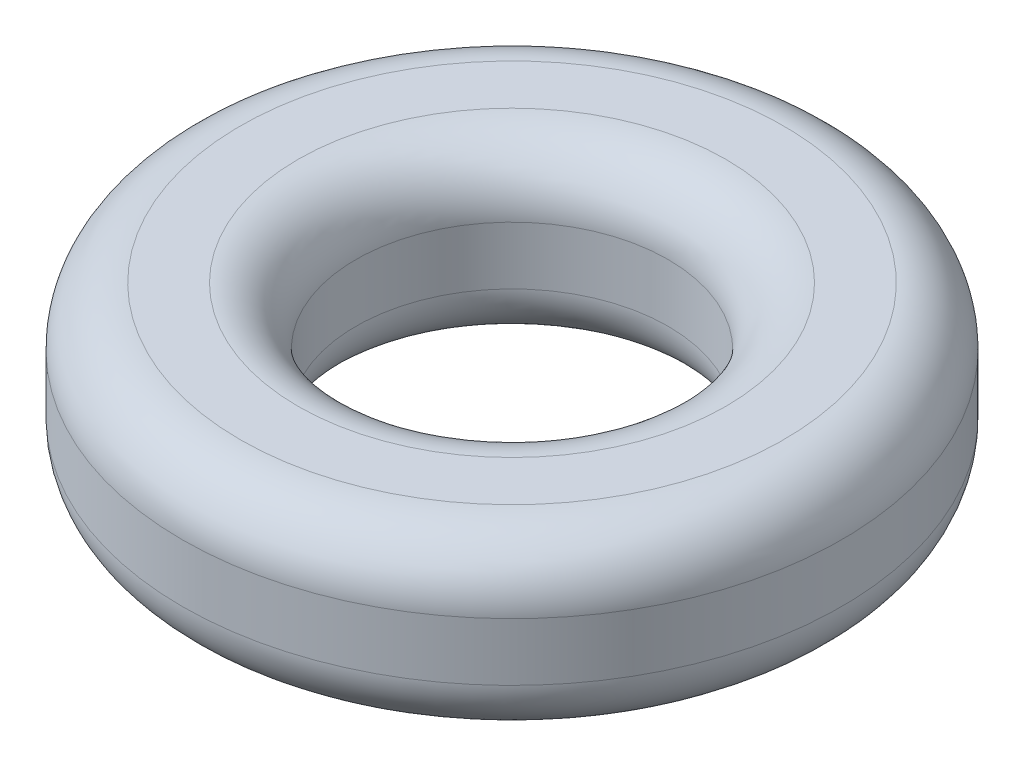
ISO-10303-21;
HEADER;
FILE_DESCRIPTION(('STEP AP214'),'2;1');
FILE_NAME('part.step','',(''),(''),'','','');
FILE_SCHEMA(('AUTOMOTIVE_DESIGN { 1 0 10303 214 1 1 1 1 }'));
ENDSEC;
DATA;
#1=APPLICATION_CONTEXT('core data for automotive mechanical design processes');
#2=APPLICATION_PROTOCOL_DEFINITION('international standard','automotive_design',2000,#1);
#3=PRODUCT_CONTEXT('',#1,'mechanical');
#4=PRODUCT('Part','Part','',(#3));
#5=PRODUCT_RELATED_PRODUCT_CATEGORY('part','',(#4));
#6=PRODUCT_DEFINITION_FORMATION('','',#4);
#7=PRODUCT_DEFINITION_CONTEXT('part definition',#1,'design');
#8=PRODUCT_DEFINITION('design','',#6,#7);
#9=PRODUCT_DEFINITION_SHAPE('','',#8);
#10=(LENGTH_UNIT() NAMED_UNIT(*) SI_UNIT(.MILLI.,.METRE.));
#11=(NAMED_UNIT(*) PLANE_ANGLE_UNIT() SI_UNIT($,.RADIAN.));
#12=(NAMED_UNIT(*) SI_UNIT($,.STERADIAN.) SOLID_ANGLE_UNIT());
#13=UNCERTAINTY_MEASURE_WITH_UNIT(LENGTH_MEASURE(1.E-05),#10,'distance_accuracy_value','');
#14=(GEOMETRIC_REPRESENTATION_CONTEXT(3) GLOBAL_UNCERTAINTY_ASSIGNED_CONTEXT((#13)) GLOBAL_UNIT_ASSIGNED_CONTEXT((#10,
#11,#12)) REPRESENTATION_CONTEXT('',''));
#15=CARTESIAN_POINT('',(0.,0.,0.));
#16=DIRECTION('',(0.,0.,1.));
#17=DIRECTION('',(1.,0.,0.));
#18=AXIS2_PLACEMENT_3D('',#15,#16,#17);
#19=CARTESIAN_POINT('',(0.,1.5,0.));
#20=DIRECTION('',(0.,1.,0.));
#21=DIRECTION('',(0.,0.,1.));
#22=AXIS2_PLACEMENT_3D('',#19,#20,#21);
#23=PLANE('',#22);
#24=CARTESIAN_POINT('',(0.,1.5,0.));
#25=DIRECTION('',(0.,1.,0.));
#26=DIRECTION('',(0.,0.,1.));
#27=AXIS2_PLACEMENT_3D('',#24,#25,#26);
#28=CIRCLE('',#27,2.35);
#29=CARTESIAN_POINT('',(0.,1.5,2.35));
#30=VERTEX_POINT('',#29);
#31=EDGE_CURVE('E56',#30,#30,#28,.T.);
#32=ORIENTED_EDGE('',*,*,#31,.T.);
#33=EDGE_LOOP('',(#32));
#34=FACE_BOUND('',#33,.T.);
#35=CARTESIAN_POINT('',(0.,1.5,0.));
#36=DIRECTION('',(0.,1.,0.));
#37=DIRECTION('',(0.,0.,1.));
#38=AXIS2_PLACEMENT_3D('',#35,#36,#37);
#39=CIRCLE('',#38,1.85);
#40=CARTESIAN_POINT('',(0.,1.5,1.85));
#41=VERTEX_POINT('',#40);
#42=EDGE_CURVE('E61',#41,#41,#39,.F.);
#43=ORIENTED_EDGE('',*,*,#42,.T.);
#44=EDGE_LOOP('',(#43));
#45=FACE_BOUND('',#44,.T.);
#46=ADVANCED_FACE('F43',(#34,#45),#23,.T.);
#47=CARTESIAN_POINT('',(0.,0.,0.));
#48=DIRECTION('',(0.,1.,0.));
#49=DIRECTION('',(0.,0.,1.));
#50=AXIS2_PLACEMENT_3D('',#47,#48,#49);
#51=PLANE('',#50);
#52=CARTESIAN_POINT('',(0.,0.,0.));
#53=DIRECTION('',(0.,1.,0.));
#54=DIRECTION('',(0.,0.,1.));
#55=AXIS2_PLACEMENT_3D('',#52,#53,#54);
#56=CIRCLE('',#55,2.35);
#57=CARTESIAN_POINT('',(0.,0.,2.35));
#58=VERTEX_POINT('',#57);
#59=EDGE_CURVE('E67',#58,#58,#56,.F.);
#60=ORIENTED_EDGE('',*,*,#59,.T.);
#61=EDGE_LOOP('',(#60));
#62=FACE_BOUND('',#61,.T.);
#63=CARTESIAN_POINT('',(0.,0.,0.));
#64=DIRECTION('',(0.,1.,0.));
#65=DIRECTION('',(0.,0.,1.));
#66=AXIS2_PLACEMENT_3D('',#63,#64,#65);
#67=CIRCLE('',#66,1.85);
#68=CARTESIAN_POINT('',(0.,0.,1.85));
#69=VERTEX_POINT('',#68);
#70=EDGE_CURVE('E71',#69,#69,#67,.T.);
#71=ORIENTED_EDGE('',*,*,#70,.T.);
#72=EDGE_LOOP('',(#71));
#73=FACE_BOUND('',#72,.T.);
#74=ADVANCED_FACE('F96',(#62,#73),#51,.F.);
#75=CARTESIAN_POINT('',(0.,1.5,0.));
#76=DIRECTION('',(0.,-1.,0.));
#77=DIRECTION('',(0.,0.,-1.));
#78=AXIS2_PLACEMENT_3D('',#75,#76,#77);
#79=CYLINDRICAL_SURFACE('',#78,2.85);
#80=CARTESIAN_POINT('',(0.,0.5,0.));
#81=DIRECTION('',(0.,1.,0.));
#82=DIRECTION('',(0.,0.,1.));
#83=AXIS2_PLACEMENT_3D('',#80,#81,#82);
#84=CIRCLE('',#83,2.85);
#85=CARTESIAN_POINT('',(0.,0.5,2.85));
#86=VERTEX_POINT('',#85);
#87=EDGE_CURVE('E75',#86,#86,#84,.T.);
#88=ORIENTED_EDGE('',*,*,#87,.T.);
#89=EDGE_LOOP('',(#88));
#90=FACE_BOUND('',#89,.T.);
#91=CARTESIAN_POINT('',(0.,1.,0.));
#92=DIRECTION('',(0.,1.,0.));
#93=DIRECTION('',(0.,0.,1.));
#94=AXIS2_PLACEMENT_3D('',#91,#92,#93);
#95=CIRCLE('',#94,2.85);
#96=CARTESIAN_POINT('',(0.,1.,2.85));
#97=VERTEX_POINT('',#96);
#98=EDGE_CURVE('E79',#97,#97,#95,.F.);
#99=ORIENTED_EDGE('',*,*,#98,.T.);
#100=EDGE_LOOP('',(#99));
#101=FACE_BOUND('',#100,.T.);
#102=ADVANCED_FACE('F84',(#90,#101),#79,.T.);
#103=CARTESIAN_POINT('',(0.,1.5,0.));
#104=DIRECTION('',(0.,-1.,0.));
#105=DIRECTION('',(0.,0.,-1.));
#106=AXIS2_PLACEMENT_3D('',#103,#104,#105);
#107=CYLINDRICAL_SURFACE('',#106,1.35);
#108=CARTESIAN_POINT('',(0.,0.5,0.));
#109=DIRECTION('',(0.,1.,0.));
#110=DIRECTION('',(0.,0.,1.));
#111=AXIS2_PLACEMENT_3D('',#108,#109,#110);
#112=CIRCLE('',#111,1.35);
#113=CARTESIAN_POINT('',(0.,0.5,1.35));
#114=VERTEX_POINT('',#113);
#115=EDGE_CURVE('E10',#114,#114,#112,.F.);
#116=ORIENTED_EDGE('',*,*,#115,.T.);
#117=EDGE_LOOP('',(#116));
#118=FACE_BOUND('',#117,.T.);
#119=CARTESIAN_POINT('',(0.,1.,0.));
#120=DIRECTION('',(0.,1.,0.));
#121=DIRECTION('',(0.,0.,1.));
#122=AXIS2_PLACEMENT_3D('',#119,#120,#121);
#123=CIRCLE('',#122,1.35);
#124=CARTESIAN_POINT('',(0.,1.,1.35));
#125=VERTEX_POINT('',#124);
#126=EDGE_CURVE('E51',#125,#125,#123,.T.);
#127=ORIENTED_EDGE('',*,*,#126,.T.);
#128=EDGE_LOOP('',(#127));
#129=FACE_BOUND('',#128,.T.);
#130=ADVANCED_FACE('F112',(#118,#129),#107,.F.);
#131=CARTESIAN_POINT('',(0.,0.5,0.));
#132=DIRECTION('',(0.,1.,0.));
#133=DIRECTION('',(0.,0.,1.));
#134=AXIS2_PLACEMENT_3D('',#131,#132,#133);
#135=TOROIDAL_SURFACE('',#134,2.35,0.5);
#136=ORIENTED_EDGE('',*,*,#59,.F.);
#137=EDGE_LOOP('',(#136));
#138=FACE_BOUND('',#137,.T.);
#139=ORIENTED_EDGE('',*,*,#87,.F.);
#140=EDGE_LOOP('',(#139));
#141=FACE_BOUND('',#140,.T.);
#142=ADVANCED_FACE('F90',(#138,#141),#135,.T.);
#143=CARTESIAN_POINT('',(0.,1.,0.));
#144=DIRECTION('',(0.,1.,0.));
#145=DIRECTION('',(0.,0.,1.));
#146=AXIS2_PLACEMENT_3D('',#143,#144,#145);
#147=TOROIDAL_SURFACE('',#146,2.35,0.5);
#148=ORIENTED_EDGE('',*,*,#98,.F.);
#149=EDGE_LOOP('',(#148));
#150=FACE_BOUND('',#149,.T.);
#151=ORIENTED_EDGE('',*,*,#31,.F.);
#152=EDGE_LOOP('',(#151));
#153=FACE_BOUND('',#152,.T.);
#154=ADVANCED_FACE('F86',(#150,#153),#147,.T.);
#155=CARTESIAN_POINT('',(0.,0.5,0.));
#156=DIRECTION('',(0.,1.,0.));
#157=DIRECTION('',(0.,0.,1.));
#158=AXIS2_PLACEMENT_3D('',#155,#156,#157);
#159=TOROIDAL_SURFACE('',#158,1.85,0.5);
#160=ORIENTED_EDGE('',*,*,#115,.F.);
#161=EDGE_LOOP('',(#160));
#162=FACE_BOUND('',#161,.T.);
#163=ORIENTED_EDGE('',*,*,#70,.F.);
#164=EDGE_LOOP('',(#163));
#165=FACE_BOUND('',#164,.T.);
#166=ADVANCED_FACE('F89',(#162,#165),#159,.T.);
#167=CARTESIAN_POINT('',(0.,1.,0.));
#168=DIRECTION('',(0.,1.,0.));
#169=DIRECTION('',(0.,0.,1.));
#170=AXIS2_PLACEMENT_3D('',#167,#168,#169);
#171=TOROIDAL_SURFACE('',#170,1.85,0.5);
#172=ORIENTED_EDGE('',*,*,#42,.F.);
#173=EDGE_LOOP('',(#172));
#174=FACE_BOUND('',#173,.T.);
#175=ORIENTED_EDGE('',*,*,#126,.F.);
#176=EDGE_LOOP('',(#175));
#177=FACE_BOUND('',#176,.T.);
#178=ADVANCED_FACE('F45',(#174,#177),#171,.T.);
#179=CLOSED_SHELL('',(#46,#74,#102,#130,#142,#154,#166,#178));
#180=MANIFOLD_SOLID_BREP('B2',#179);
#181=ADVANCED_BREP_SHAPE_REPRESENTATION('',(#18,#180),#14);
#182=SHAPE_DEFINITION_REPRESENTATION(#9,#181);
ENDSEC;
END-ISO-10303-21;
